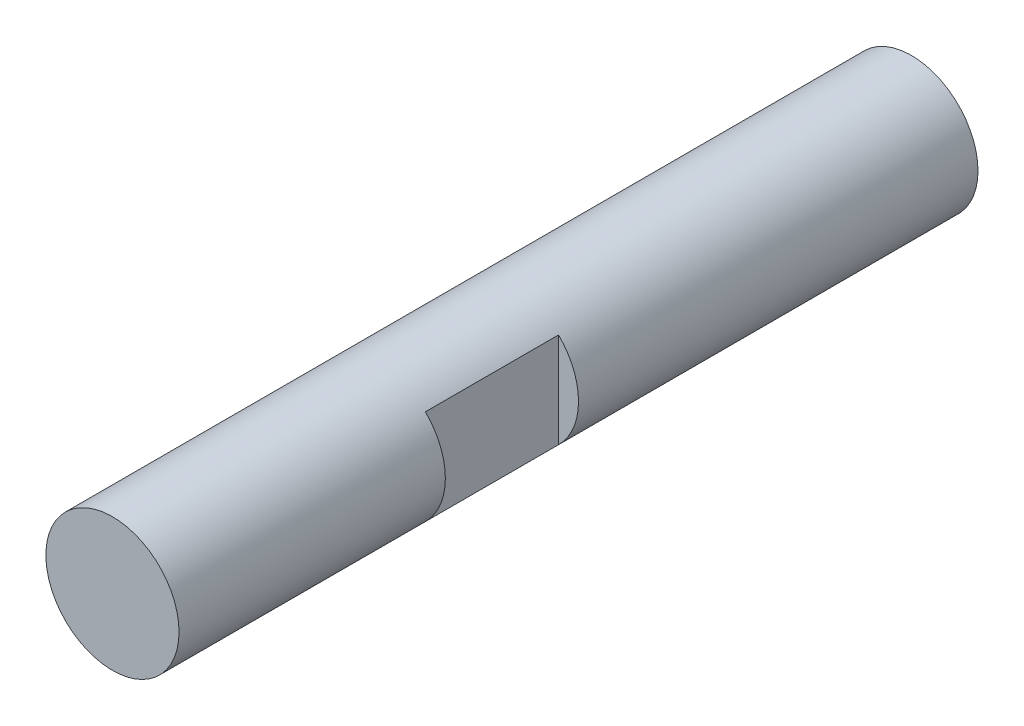
ISO-10303-21;
HEADER;
FILE_DESCRIPTION(('STEP AP214'),'2;1');
FILE_NAME('part.step','',(''),(''),'','','');
FILE_SCHEMA(('AUTOMOTIVE_DESIGN { 1 0 10303 214 1 1 1 1 }'));
ENDSEC;
DATA;
#1=APPLICATION_CONTEXT('core data for automotive mechanical design processes');
#2=APPLICATION_PROTOCOL_DEFINITION('international standard','automotive_design',2000,#1);
#3=PRODUCT_CONTEXT('',#1,'mechanical');
#4=PRODUCT('Part','Part','',(#3));
#5=PRODUCT_RELATED_PRODUCT_CATEGORY('part','',(#4));
#6=PRODUCT_DEFINITION_FORMATION('','',#4);
#7=PRODUCT_DEFINITION_CONTEXT('part definition',#1,'design');
#8=PRODUCT_DEFINITION('design','',#6,#7);
#9=PRODUCT_DEFINITION_SHAPE('','',#8);
#10=(LENGTH_UNIT() NAMED_UNIT(*) SI_UNIT(.MILLI.,.METRE.));
#11=(NAMED_UNIT(*) PLANE_ANGLE_UNIT() SI_UNIT($,.RADIAN.));
#12=(NAMED_UNIT(*) SI_UNIT($,.STERADIAN.) SOLID_ANGLE_UNIT());
#13=UNCERTAINTY_MEASURE_WITH_UNIT(LENGTH_MEASURE(1.E-05),#10,'distance_accuracy_value','');
#14=(GEOMETRIC_REPRESENTATION_CONTEXT(3) GLOBAL_UNCERTAINTY_ASSIGNED_CONTEXT((#13)) GLOBAL_UNIT_ASSIGNED_CONTEXT((#10,
#11,#12)) REPRESENTATION_CONTEXT('',''));
#15=CARTESIAN_POINT('',(0.,0.,0.));
#16=DIRECTION('',(0.,0.,1.));
#17=DIRECTION('',(1.,0.,0.));
#18=AXIS2_PLACEMENT_3D('',#15,#16,#17);
#19=CARTESIAN_POINT('',(0.,0.,38.1));
#20=DIRECTION('',(0.,0.,1.));
#21=DIRECTION('',(1.,0.,0.));
#22=AXIS2_PLACEMENT_3D('',#19,#20,#21);
#23=PLANE('',#22);
#24=DIRECTION('',(0.,1.,0.));
#25=VECTOR('',#24,1.);
#26=CARTESIAN_POINT('',(4.445,-4.53480705212471,38.1));
#27=LINE('',#26,#25);
#28=CARTESIAN_POINT('',(4.445,-4.53480705212471,38.1));
#29=VERTEX_POINT('',#28);
#30=CARTESIAN_POINT('',(4.445,4.53480705212471,38.1));
#31=VERTEX_POINT('',#30);
#32=EDGE_CURVE('E100',#29,#31,#27,.T.);
#33=ORIENTED_EDGE('',*,*,#32,.F.);
#34=CARTESIAN_POINT('',(0.,0.,38.1));
#35=DIRECTION('',(0.,0.,1.));
#36=DIRECTION('',(1.,0.,0.));
#37=AXIS2_PLACEMENT_3D('',#34,#35,#36);
#38=CIRCLE('',#37,6.35);
#39=EDGE_CURVE('E55',#29,#31,#38,.T.);
#40=ORIENTED_EDGE('',*,*,#39,.T.);
#41=EDGE_LOOP('',(#33,#40));
#42=FACE_BOUND('',#41,.T.);
#43=ADVANCED_FACE('F45',(#42),#23,.T.);
#44=CARTESIAN_POINT('',(0.,0.,38.1));
#45=DIRECTION('',(0.,0.,-1.));
#46=DIRECTION('',(-1.,0.,0.));
#47=AXIS2_PLACEMENT_3D('',#44,#45,#46);
#48=CYLINDRICAL_SURFACE('',#47,6.35);
#49=CARTESIAN_POINT('',(-4.445,-4.53480705212471,38.1));
#50=VERTEX_POINT('',#49);
#51=EDGE_CURVE('E11',#50,#29,#38,.T.);
#52=ORIENTED_EDGE('',*,*,#51,.F.);
#53=DIRECTION('',(0.,0.,-1.));
#54=VECTOR('',#53,1.);
#55=CARTESIAN_POINT('',(-4.445,-4.53480705212471,50.8));
#56=LINE('',#55,#54);
#57=CARTESIAN_POINT('',(-4.445,-4.53480705212471,50.8));
#58=VERTEX_POINT('',#57);
#59=EDGE_CURVE('E81',#58,#50,#56,.T.);
#60=ORIENTED_EDGE('',*,*,#59,.F.);
#61=CARTESIAN_POINT('',(0.,0.,50.8));
#62=DIRECTION('',(0.,0.,1.));
#63=DIRECTION('',(1.,0.,0.));
#64=AXIS2_PLACEMENT_3D('',#61,#62,#63);
#65=CIRCLE('',#64,6.35);
#66=CARTESIAN_POINT('',(4.445,-4.53480705212471,50.8));
#67=VERTEX_POINT('',#66);
#68=EDGE_CURVE('E86',#58,#67,#65,.T.);
#69=ORIENTED_EDGE('',*,*,#68,.T.);
#70=CARTESIAN_POINT('',(4.445,4.53480705212471,50.8));
#71=VERTEX_POINT('',#70);
#72=EDGE_CURVE('E105',#67,#71,#65,.T.);
#73=ORIENTED_EDGE('',*,*,#72,.T.);
#74=DIRECTION('',(0.,0.,-1.));
#75=VECTOR('',#74,1.);
#76=CARTESIAN_POINT('',(4.445,4.53480705212471,50.8));
#77=LINE('',#76,#75);
#78=EDGE_CURVE('E115',#71,#31,#77,.T.);
#79=ORIENTED_EDGE('',*,*,#78,.T.);
#80=ORIENTED_EDGE('',*,*,#39,.F.);
#81=EDGE_LOOP('',(#52,#60,#69,#73,#79,#80));
#82=FACE_BOUND('',#81,.T.);
#83=CARTESIAN_POINT('',(0.,0.,0.));
#84=DIRECTION('',(0.,0.,1.));
#85=DIRECTION('',(1.,0.,0.));
#86=AXIS2_PLACEMENT_3D('',#83,#84,#85);
#87=CIRCLE('',#86,6.35);
#88=CARTESIAN_POINT('',(6.35,0.,0.));
#89=VERTEX_POINT('',#88);
#90=EDGE_CURVE('E49',#89,#89,#87,.T.);
#91=ORIENTED_EDGE('',*,*,#90,.T.);
#92=EDGE_LOOP('',(#91));
#93=FACE_BOUND('',#92,.T.);
#94=CARTESIAN_POINT('',(0.,0.,76.2));
#95=DIRECTION('',(0.,0.,1.));
#96=DIRECTION('',(1.,0.,0.));
#97=AXIS2_PLACEMENT_3D('',#94,#95,#96);
#98=CIRCLE('',#97,6.35);
#99=CARTESIAN_POINT('',(6.35,0.,76.2));
#100=VERTEX_POINT('',#99);
#101=EDGE_CURVE('E104',#100,#100,#98,.T.);
#102=ORIENTED_EDGE('',*,*,#101,.F.);
#103=EDGE_LOOP('',(#102));
#104=FACE_BOUND('',#103,.T.);
#105=ADVANCED_FACE('F47',(#82,#93,#104),#48,.T.);
#106=DIRECTION('',(1.,0.,0.));
#107=VECTOR('',#106,1.);
#108=CARTESIAN_POINT('',(-4.445,-4.53480705212471,38.1));
#109=LINE('',#108,#107);
#110=EDGE_CURVE('E60',#50,#29,#109,.T.);
#111=ORIENTED_EDGE('',*,*,#110,.F.);
#112=ORIENTED_EDGE('',*,*,#51,.T.);
#113=EDGE_LOOP('',(#111,#112));
#114=FACE_BOUND('',#113,.T.);
#115=ADVANCED_FACE('F132',(#114),#23,.T.);
#116=CARTESIAN_POINT('',(0.,0.,0.));
#117=DIRECTION('',(0.,0.,1.));
#118=DIRECTION('',(1.,0.,0.));
#119=AXIS2_PLACEMENT_3D('',#116,#117,#118);
#120=PLANE('',#119);
#121=ORIENTED_EDGE('',*,*,#90,.F.);
#122=EDGE_LOOP('',(#121));
#123=FACE_BOUND('',#122,.T.);
#124=ADVANCED_FACE('F130',(#123),#120,.F.);
#125=CARTESIAN_POINT('',(-4.445,-4.53480705212471,50.8));
#126=DIRECTION('',(0.,1.,0.));
#127=DIRECTION('',(0.,0.,1.));
#128=AXIS2_PLACEMENT_3D('',#125,#126,#127);
#129=PLANE('',#128);
#130=ORIENTED_EDGE('',*,*,#110,.T.);
#131=DIRECTION('',(0.,0.,-1.));
#132=VECTOR('',#131,1.);
#133=CARTESIAN_POINT('',(4.445,-4.53480705212471,50.8));
#134=LINE('',#133,#132);
#135=EDGE_CURVE('E89',#67,#29,#134,.T.);
#136=ORIENTED_EDGE('',*,*,#135,.F.);
#137=DIRECTION('',(1.,0.,0.));
#138=VECTOR('',#137,1.);
#139=CARTESIAN_POINT('',(-4.445,-4.53480705212471,50.8));
#140=LINE('',#139,#138);
#141=EDGE_CURVE('E92',#58,#67,#140,.T.);
#142=ORIENTED_EDGE('',*,*,#141,.F.);
#143=ORIENTED_EDGE('',*,*,#59,.T.);
#144=EDGE_LOOP('',(#130,#136,#142,#143));
#145=FACE_BOUND('',#144,.T.);
#146=ADVANCED_FACE('F93',(#145),#129,.F.);
#147=CARTESIAN_POINT('',(4.445,-4.53480705212471,50.8));
#148=DIRECTION('',(-1.,0.,0.));
#149=DIRECTION('',(0.,0.,1.));
#150=AXIS2_PLACEMENT_3D('',#147,#148,#149);
#151=PLANE('',#150);
#152=ORIENTED_EDGE('',*,*,#32,.T.);
#153=ORIENTED_EDGE('',*,*,#78,.F.);
#154=DIRECTION('',(0.,1.,0.));
#155=VECTOR('',#154,1.);
#156=CARTESIAN_POINT('',(4.445,-4.53480705212471,50.8));
#157=LINE('',#156,#155);
#158=EDGE_CURVE('E99',#67,#71,#157,.T.);
#159=ORIENTED_EDGE('',*,*,#158,.F.);
#160=ORIENTED_EDGE('',*,*,#135,.T.);
#161=EDGE_LOOP('',(#152,#153,#159,#160));
#162=FACE_BOUND('',#161,.T.);
#163=ADVANCED_FACE('F137',(#162),#151,.F.);
#164=CARTESIAN_POINT('',(0.,0.,50.8));
#165=DIRECTION('',(0.,0.,1.));
#166=DIRECTION('',(1.,0.,0.));
#167=AXIS2_PLACEMENT_3D('',#164,#165,#166);
#168=PLANE('',#167);
#169=ORIENTED_EDGE('',*,*,#68,.F.);
#170=ORIENTED_EDGE('',*,*,#141,.T.);
#171=EDGE_LOOP('',(#169,#170));
#172=FACE_BOUND('',#171,.T.);
#173=ADVANCED_FACE('F102',(#172),#168,.F.);
#174=CARTESIAN_POINT('',(0.,0.,76.2));
#175=DIRECTION('',(0.,0.,1.));
#176=DIRECTION('',(1.,0.,0.));
#177=AXIS2_PLACEMENT_3D('',#174,#175,#176);
#178=PLANE('',#177);
#179=ORIENTED_EDGE('',*,*,#101,.T.);
#180=EDGE_LOOP('',(#179));
#181=FACE_BOUND('',#180,.T.);
#182=ADVANCED_FACE('F151',(#181),#178,.T.);
#183=ORIENTED_EDGE('',*,*,#72,.F.);
#184=ORIENTED_EDGE('',*,*,#158,.T.);
#185=EDGE_LOOP('',(#183,#184));
#186=FACE_BOUND('',#185,.T.);
#187=ADVANCED_FACE('F148',(#186),#168,.F.);
#188=CLOSED_SHELL('',(#43,#105,#115,#124,#146,#163,#173,#182,#187));
#189=MANIFOLD_SOLID_BREP('B2',#188);
#190=ADVANCED_BREP_SHAPE_REPRESENTATION('',(#18,#189),#14);
#191=SHAPE_DEFINITION_REPRESENTATION(#9,#190);
ENDSEC;
END-ISO-10303-21;
